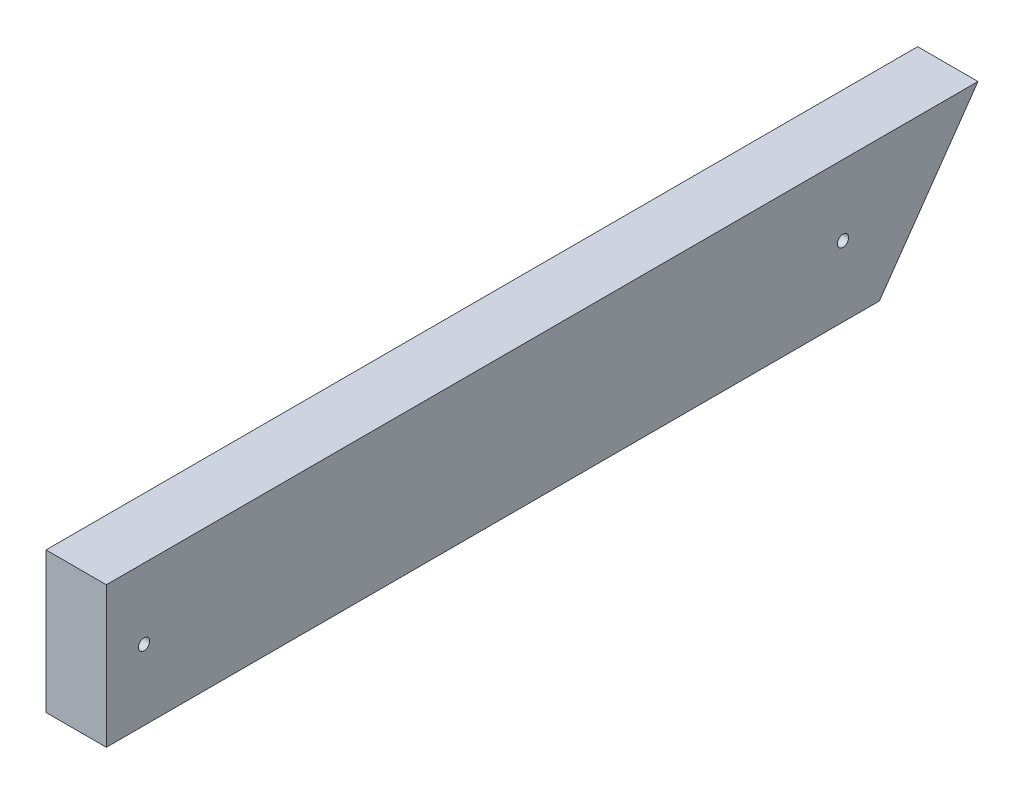
ISO-10303-21;
HEADER;
FILE_DESCRIPTION(('STEP AP214'),'2;1');
FILE_NAME('part.step','',(''),(''),'','','');
FILE_SCHEMA(('AUTOMOTIVE_DESIGN { 1 0 10303 214 1 1 1 1 }'));
ENDSEC;
DATA;
#1=APPLICATION_CONTEXT('core data for automotive mechanical design processes');
#2=APPLICATION_PROTOCOL_DEFINITION('international standard','automotive_design',2000,#1);
#3=PRODUCT_CONTEXT('',#1,'mechanical');
#4=PRODUCT('Part','Part','',(#3));
#5=PRODUCT_RELATED_PRODUCT_CATEGORY('part','',(#4));
#6=PRODUCT_DEFINITION_FORMATION('','',#4);
#7=PRODUCT_DEFINITION_CONTEXT('part definition',#1,'design');
#8=PRODUCT_DEFINITION('design','',#6,#7);
#9=PRODUCT_DEFINITION_SHAPE('','',#8);
#10=(LENGTH_UNIT() NAMED_UNIT(*) SI_UNIT(.MILLI.,.METRE.));
#11=(NAMED_UNIT(*) PLANE_ANGLE_UNIT() SI_UNIT($,.RADIAN.));
#12=(NAMED_UNIT(*) SI_UNIT($,.STERADIAN.) SOLID_ANGLE_UNIT());
#13=UNCERTAINTY_MEASURE_WITH_UNIT(LENGTH_MEASURE(1.E-05),#10,'distance_accuracy_value','');
#14=(GEOMETRIC_REPRESENTATION_CONTEXT(3) GLOBAL_UNCERTAINTY_ASSIGNED_CONTEXT((#13)) GLOBAL_UNIT_ASSIGNED_CONTEXT((#10,
#11,#12)) REPRESENTATION_CONTEXT('',''));
#15=CARTESIAN_POINT('',(0.,0.,0.));
#16=DIRECTION('',(0.,0.,1.));
#17=DIRECTION('',(1.,0.,0.));
#18=AXIS2_PLACEMENT_3D('',#15,#16,#17);
#19=CARTESIAN_POINT('',(38.1,88.9000000000007,0.));
#20=DIRECTION('',(0.,0.,-1.));
#21=DIRECTION('',(0.,1.,0.));
#22=AXIS2_PLACEMENT_3D('',#19,#20,#21);
#23=PLANE('',#22);
#24=DIRECTION('',(0.,-1.,0.));
#25=VECTOR('',#24,1.);
#26=CARTESIAN_POINT('',(0.,88.9000000000007,0.));
#27=LINE('',#26,#25);
#28=CARTESIAN_POINT('',(0.,88.9000000000007,0.));
#29=VERTEX_POINT('',#28);
#30=CARTESIAN_POINT('',(0.,0.,0.));
#31=VERTEX_POINT('',#30);
#32=EDGE_CURVE('E96',#29,#31,#27,.T.);
#33=ORIENTED_EDGE('',*,*,#32,.T.);
#34=DIRECTION('',(-1.,0.,0.));
#35=VECTOR('',#34,1.);
#36=CARTESIAN_POINT('',(38.1,0.,0.));
#37=LINE('',#36,#35);
#38=CARTESIAN_POINT('',(38.1,0.,0.));
#39=VERTEX_POINT('',#38);
#40=EDGE_CURVE('E11',#39,#31,#37,.T.);
#41=ORIENTED_EDGE('',*,*,#40,.F.);
#42=DIRECTION('',(0.,-1.,0.));
#43=VECTOR('',#42,1.);
#44=CARTESIAN_POINT('',(38.1,88.9000000000007,0.));
#45=LINE('',#44,#43);
#46=CARTESIAN_POINT('',(38.1,88.9000000000007,0.));
#47=VERTEX_POINT('',#46);
#48=EDGE_CURVE('E84',#47,#39,#45,.T.);
#49=ORIENTED_EDGE('',*,*,#48,.F.);
#50=DIRECTION('',(-1.,0.,0.));
#51=VECTOR('',#50,1.);
#52=CARTESIAN_POINT('',(38.1,88.9000000000007,0.));
#53=LINE('',#52,#51);
#54=EDGE_CURVE('E92',#47,#29,#53,.T.);
#55=ORIENTED_EDGE('',*,*,#54,.T.);
#56=EDGE_LOOP('',(#33,#41,#49,#55));
#57=FACE_BOUND('',#56,.T.);
#58=ADVANCED_FACE('F33',(#57),#23,.F.);
#59=CARTESIAN_POINT('',(38.1,0.,-488.13777319626));
#60=DIRECTION('',(0.,1.,0.));
#61=DIRECTION('',(0.,0.,1.));
#62=AXIS2_PLACEMENT_3D('',#59,#60,#61);
#63=PLANE('',#62);
#64=DIRECTION('',(0.,0.,-1.));
#65=VECTOR('',#64,1.);
#66=CARTESIAN_POINT('',(0.,0.,-488.13777319626));
#67=LINE('',#66,#65);
#68=CARTESIAN_POINT('',(0.,0.,-488.13777319626));
#69=VERTEX_POINT('',#68);
#70=EDGE_CURVE('E88',#31,#69,#67,.T.);
#71=ORIENTED_EDGE('',*,*,#70,.T.);
#72=DIRECTION('',(-1.,0.,0.));
#73=VECTOR('',#72,1.);
#74=CARTESIAN_POINT('',(38.1,0.,-488.13777319626));
#75=LINE('',#74,#73);
#76=CARTESIAN_POINT('',(38.1,0.,-488.13777319626));
#77=VERTEX_POINT('',#76);
#78=EDGE_CURVE('E41',#77,#69,#75,.T.);
#79=ORIENTED_EDGE('',*,*,#78,.F.);
#80=DIRECTION('',(0.,0.,-1.));
#81=VECTOR('',#80,1.);
#82=CARTESIAN_POINT('',(38.1,0.,-488.13777319626));
#83=LINE('',#82,#81);
#84=EDGE_CURVE('E79',#39,#77,#83,.T.);
#85=ORIENTED_EDGE('',*,*,#84,.F.);
#86=ORIENTED_EDGE('',*,*,#40,.T.);
#87=EDGE_LOOP('',(#71,#79,#85,#86));
#88=FACE_BOUND('',#87,.T.);
#89=ADVANCED_FACE('F87',(#88),#63,.F.);
#90=CARTESIAN_POINT('',(38.1,88.9000000000001,-550.386223343104));
#91=DIRECTION('',(0.,0.57357643635105,0.819152044288989));
#92=DIRECTION('',(0.,-0.819152044288989,0.57357643635105));
#93=AXIS2_PLACEMENT_3D('',#90,#91,#92);
#94=PLANE('',#93);
#95=DIRECTION('',(0.,0.819152044288989,-0.57357643635105));
#96=VECTOR('',#95,1.);
#97=CARTESIAN_POINT('',(0.,88.9000000000001,-550.386223343104));
#98=LINE('',#97,#96);
#99=CARTESIAN_POINT('',(0.,88.9000000000001,-550.386223343104));
#100=VERTEX_POINT('',#99);
#101=EDGE_CURVE('E66',#69,#100,#98,.T.);
#102=ORIENTED_EDGE('',*,*,#101,.T.);
#103=DIRECTION('',(-1.,0.,0.));
#104=VECTOR('',#103,1.);
#105=CARTESIAN_POINT('',(38.1,88.9000000000001,-550.386223343104));
#106=LINE('',#105,#104);
#107=CARTESIAN_POINT('',(38.1,88.9000000000001,-550.386223343104));
#108=VERTEX_POINT('',#107);
#109=EDGE_CURVE('E89',#108,#100,#106,.T.);
#110=ORIENTED_EDGE('',*,*,#109,.F.);
#111=DIRECTION('',(0.,0.819152044288989,-0.57357643635105));
#112=VECTOR('',#111,1.);
#113=CARTESIAN_POINT('',(38.1,88.9000000000001,-550.386223343104));
#114=LINE('',#113,#112);
#115=EDGE_CURVE('E82',#77,#108,#114,.T.);
#116=ORIENTED_EDGE('',*,*,#115,.F.);
#117=ORIENTED_EDGE('',*,*,#78,.T.);
#118=EDGE_LOOP('',(#102,#110,#116,#117));
#119=FACE_BOUND('',#118,.T.);
#120=ADVANCED_FACE('F90',(#119),#94,.F.);
#121=CARTESIAN_POINT('',(38.1,88.9000000000007,0.));
#122=DIRECTION('',(0.,-1.,0.));
#123=DIRECTION('',(0.,0.,-1.));
#124=AXIS2_PLACEMENT_3D('',#121,#122,#123);
#125=PLANE('',#124);
#126=DIRECTION('',(0.,0.,1.));
#127=VECTOR('',#126,1.);
#128=CARTESIAN_POINT('',(0.,88.9000000000007,0.));
#129=LINE('',#128,#127);
#130=EDGE_CURVE('E72',#100,#29,#129,.T.);
#131=ORIENTED_EDGE('',*,*,#130,.T.);
#132=ORIENTED_EDGE('',*,*,#54,.F.);
#133=DIRECTION('',(0.,0.,1.));
#134=VECTOR('',#133,1.);
#135=CARTESIAN_POINT('',(38.1,88.9000000000007,0.));
#136=LINE('',#135,#134);
#137=EDGE_CURVE('E49',#108,#47,#136,.T.);
#138=ORIENTED_EDGE('',*,*,#137,.F.);
#139=ORIENTED_EDGE('',*,*,#109,.T.);
#140=EDGE_LOOP('',(#131,#132,#138,#139));
#141=FACE_BOUND('',#140,.T.);
#142=ADVANCED_FACE('F104',(#141),#125,.F.);
#143=CARTESIAN_POINT('',(38.1,0.,0.));
#144=DIRECTION('',(-1.,0.,0.));
#145=DIRECTION('',(0.,0.,1.));
#146=AXIS2_PLACEMENT_3D('',#143,#144,#145);
#147=PLANE('',#146);
#148=CARTESIAN_POINT('',(38.1,44.45,-23.8125));
#149=DIRECTION('',(1.,0.,0.));
#150=DIRECTION('',(0.,0.,-1.));
#151=AXIS2_PLACEMENT_3D('',#148,#149,#150);
#152=CIRCLE('',#151,3.57187500000001);
#153=CARTESIAN_POINT('',(38.1,44.45,-27.384375));
#154=VERTEX_POINT('',#153);
#155=EDGE_CURVE('E116',#154,#154,#152,.T.);
#156=ORIENTED_EDGE('',*,*,#155,.F.);
#157=EDGE_LOOP('',(#156));
#158=FACE_BOUND('',#157,.T.);
#159=CARTESIAN_POINT('',(38.1,44.4500000000001,-465.1375));
#160=DIRECTION('',(1.,0.,0.));
#161=DIRECTION('',(0.,0.,-1.));
#162=AXIS2_PLACEMENT_3D('',#159,#160,#161);
#163=CIRCLE('',#162,3.57187499999998);
#164=CARTESIAN_POINT('',(38.1,44.4500000000001,-468.709375));
#165=VERTEX_POINT('',#164);
#166=EDGE_CURVE('E110',#165,#165,#163,.T.);
#167=ORIENTED_EDGE('',*,*,#166,.F.);
#168=EDGE_LOOP('',(#167));
#169=FACE_BOUND('',#168,.T.);
#170=ORIENTED_EDGE('',*,*,#48,.T.);
#171=ORIENTED_EDGE('',*,*,#84,.T.);
#172=ORIENTED_EDGE('',*,*,#115,.T.);
#173=ORIENTED_EDGE('',*,*,#137,.T.);
#174=EDGE_LOOP('',(#170,#171,#172,#173));
#175=FACE_BOUND('',#174,.T.);
#176=ADVANCED_FACE('F80',(#158,#169,#175),#147,.F.);
#177=CARTESIAN_POINT('',(0.,0.,0.));
#178=DIRECTION('',(-1.,0.,0.));
#179=DIRECTION('',(0.,0.,1.));
#180=AXIS2_PLACEMENT_3D('',#177,#178,#179);
#181=PLANE('',#180);
#182=CARTESIAN_POINT('',(0.,44.45,-23.8125));
#183=DIRECTION('',(1.,0.,0.));
#184=DIRECTION('',(0.,0.,-1.));
#185=AXIS2_PLACEMENT_3D('',#182,#183,#184);
#186=CIRCLE('',#185,3.57187500000001);
#187=CARTESIAN_POINT('',(0.,44.45,-27.384375));
#188=VERTEX_POINT('',#187);
#189=EDGE_CURVE('E99',#188,#188,#186,.T.);
#190=ORIENTED_EDGE('',*,*,#189,.T.);
#191=EDGE_LOOP('',(#190));
#192=FACE_BOUND('',#191,.T.);
#193=CARTESIAN_POINT('',(0.,44.4500000000001,-465.1375));
#194=DIRECTION('',(1.,0.,0.));
#195=DIRECTION('',(0.,0.,-1.));
#196=AXIS2_PLACEMENT_3D('',#193,#194,#195);
#197=CIRCLE('',#196,3.57187499999998);
#198=CARTESIAN_POINT('',(0.,44.4500000000001,-468.709375));
#199=VERTEX_POINT('',#198);
#200=EDGE_CURVE('E113',#199,#199,#197,.T.);
#201=ORIENTED_EDGE('',*,*,#200,.T.);
#202=EDGE_LOOP('',(#201));
#203=FACE_BOUND('',#202,.T.);
#204=ORIENTED_EDGE('',*,*,#32,.F.);
#205=ORIENTED_EDGE('',*,*,#130,.F.);
#206=ORIENTED_EDGE('',*,*,#101,.F.);
#207=ORIENTED_EDGE('',*,*,#70,.F.);
#208=EDGE_LOOP('',(#204,#205,#206,#207));
#209=FACE_BOUND('',#208,.T.);
#210=ADVANCED_FACE('F107',(#192,#203,#209),#181,.T.);
#211=CARTESIAN_POINT('',(0.,44.4500000000001,-465.1375));
#212=DIRECTION('',(1.,0.,0.));
#213=DIRECTION('',(0.,0.,-1.));
#214=AXIS2_PLACEMENT_3D('',#211,#212,#213);
#215=CYLINDRICAL_SURFACE('',#214,3.57187499999998);
#216=CARTESIAN_POINT('',(0.,44.4500000000001,-468.709375));
#217=CARTESIAN_POINT('',(0.396875,44.4500000000001,-468.709375));
#218=CARTESIAN_POINT('',(0.79375,44.4500000000001,-468.709375));
#219=CARTESIAN_POINT('',(1.5875,44.4500000000001,-468.709375));
#220=CARTESIAN_POINT('',(1.984375,44.4500000000001,-468.709375));
#221=CARTESIAN_POINT('',(2.778125,44.4500000000001,-468.709375));
#222=CARTESIAN_POINT('',(3.175,44.4500000000001,-468.709375));
#223=CARTESIAN_POINT('',(3.96875,44.4500000000001,-468.709375));
#224=CARTESIAN_POINT('',(4.365625,44.4500000000001,-468.709375));
#225=CARTESIAN_POINT('',(5.159375,44.4500000000001,-468.709375));
#226=CARTESIAN_POINT('',(5.55625,44.4500000000001,-468.709375));
#227=CARTESIAN_POINT('',(6.35,44.4500000000001,-468.709375));
#228=CARTESIAN_POINT('',(6.746875,44.4500000000001,-468.709375));
#229=CARTESIAN_POINT('',(7.540625,44.4500000000001,-468.709375));
#230=CARTESIAN_POINT('',(7.9375,44.4500000000001,-468.709375));
#231=CARTESIAN_POINT('',(8.73125,44.4500000000001,-468.709375));
#232=CARTESIAN_POINT('',(9.128125,44.4500000000001,-468.709375));
#233=CARTESIAN_POINT('',(9.921875,44.4500000000001,-468.709375));
#234=CARTESIAN_POINT('',(10.31875,44.4500000000001,-468.709375));
#235=CARTESIAN_POINT('',(11.1125,44.4500000000001,-468.709375));
#236=CARTESIAN_POINT('',(11.509375,44.4500000000001,-468.709375));
#237=CARTESIAN_POINT('',(12.303125,44.4500000000001,-468.709375));
#238=CARTESIAN_POINT('',(12.7,44.4500000000001,-468.709375));
#239=CARTESIAN_POINT('',(13.49375,44.4500000000001,-468.709375));
#240=CARTESIAN_POINT('',(13.890625,44.4500000000001,-468.709375));
#241=CARTESIAN_POINT('',(14.684375,44.4500000000001,-468.709375));
#242=CARTESIAN_POINT('',(15.08125,44.4500000000001,-468.709375));
#243=CARTESIAN_POINT('',(15.875,44.4500000000001,-468.709375));
#244=CARTESIAN_POINT('',(16.271875,44.4500000000001,-468.709375));
#245=CARTESIAN_POINT('',(17.065625,44.4500000000001,-468.709375));
#246=CARTESIAN_POINT('',(17.4625,44.4500000000001,-468.709375));
#247=CARTESIAN_POINT('',(18.25625,44.4500000000001,-468.709375));
#248=CARTESIAN_POINT('',(18.653125,44.4500000000001,-468.709375));
#249=CARTESIAN_POINT('',(19.446875,44.4500000000001,-468.709375));
#250=CARTESIAN_POINT('',(19.84375,44.4500000000001,-468.709375));
#251=CARTESIAN_POINT('',(20.6375,44.4500000000001,-468.709375));
#252=CARTESIAN_POINT('',(21.034375,44.4500000000001,-468.709375));
#253=CARTESIAN_POINT('',(21.828125,44.4500000000001,-468.709375));
#254=CARTESIAN_POINT('',(22.225,44.4500000000001,-468.709375));
#255=CARTESIAN_POINT('',(23.01875,44.4500000000001,-468.709375));
#256=CARTESIAN_POINT('',(23.415625,44.4500000000001,-468.709375));
#257=CARTESIAN_POINT('',(24.209375,44.4500000000001,-468.709375));
#258=CARTESIAN_POINT('',(24.60625,44.4500000000001,-468.709375));
#259=CARTESIAN_POINT('',(25.4,44.4500000000001,-468.709375));
#260=CARTESIAN_POINT('',(25.796875,44.4500000000001,-468.709375));
#261=CARTESIAN_POINT('',(26.590625,44.4500000000001,-468.709375));
#262=CARTESIAN_POINT('',(26.9875,44.4500000000001,-468.709375));
#263=CARTESIAN_POINT('',(27.78125,44.4500000000001,-468.709375));
#264=CARTESIAN_POINT('',(28.178125,44.4500000000001,-468.709375));
#265=CARTESIAN_POINT('',(28.971875,44.4500000000001,-468.709375));
#266=CARTESIAN_POINT('',(29.36875,44.4500000000001,-468.709375));
#267=CARTESIAN_POINT('',(30.1625,44.4500000000001,-468.709375));
#268=CARTESIAN_POINT('',(30.559375,44.4500000000001,-468.709375));
#269=CARTESIAN_POINT('',(31.353125,44.4500000000001,-468.709375));
#270=CARTESIAN_POINT('',(31.75,44.4500000000001,-468.709375));
#271=CARTESIAN_POINT('',(32.54375,44.4500000000001,-468.709375));
#272=CARTESIAN_POINT('',(32.940625,44.4500000000001,-468.709375));
#273=CARTESIAN_POINT('',(33.734375,44.4500000000001,-468.709375));
#274=CARTESIAN_POINT('',(34.13125,44.4500000000001,-468.709375));
#275=CARTESIAN_POINT('',(34.925,44.4500000000001,-468.709375));
#276=CARTESIAN_POINT('',(35.321875,44.4500000000001,-468.709375));
#277=CARTESIAN_POINT('',(36.115625,44.4500000000001,-468.709375));
#278=CARTESIAN_POINT('',(36.5125,44.4500000000001,-468.709375));
#279=CARTESIAN_POINT('',(37.30625,44.4500000000001,-468.709375));
#280=CARTESIAN_POINT('',(37.703125,44.4500000000001,-468.709375));
#281=CARTESIAN_POINT('',(38.1,44.4500000000001,-468.709375));
#282=B_SPLINE_CURVE_WITH_KNOTS('',3,(#216,#217,#218,#219,#220,#221,#222,#223,#224,#225,#226,
#227,#228,#229,#230,#231,#232,#233,#234,#235,#236,#237,#238,#239,#240,#241,#242,#243,#244,#245,
#246,#247,#248,#249,#250,#251,#252,#253,#254,#255,#256,#257,#258,#259,#260,#261,#262,#263,#264,
#265,#266,#267,#268,#269,#270,#271,#272,#273,#274,#275,#276,#277,#278,#279,#280,#281),
.UNSPECIFIED.,.F.,.F.,(4,2,2,2,2,2,2,2,2,2,2,2,2,2,2,2,2,2,2,2,2,2,2,2,2,2,2,2,2,2,2,2,4),(0.,
1.190625,2.38125,3.571875,4.7625,5.953125,7.14375,8.334375,9.525,10.715625,11.90625,13.096875,
14.2875,15.478125,16.66875,17.859375,19.05,20.240625,21.43125,22.621875,23.8125,25.003125,
26.19375,27.384375,28.575,29.765625,30.95625,32.146875,33.3375,34.528125,35.71875,36.909375,
38.1),.UNSPECIFIED.);
#283=EDGE_CURVE('BSEAM127',#199,#165,#282,.T.);
#284=ORIENTED_EDGE('',*,*,#200,.F.);
#285=ORIENTED_EDGE('',*,*,#166,.T.);
#286=ORIENTED_EDGE('',*,*,#283,.T.);
#287=ORIENTED_EDGE('',*,*,#283,.F.);
#288=EDGE_LOOP('',(#284,#286,#285,#287));
#289=FACE_BOUND('',#288,.T.);
#290=ADVANCED_FACE('F127',(#289),#215,.F.);
#291=CARTESIAN_POINT('',(0.,44.45,-23.8125));
#292=DIRECTION('',(1.,0.,0.));
#293=DIRECTION('',(0.,0.,-1.));
#294=AXIS2_PLACEMENT_3D('',#291,#292,#293);
#295=CYLINDRICAL_SURFACE('',#294,3.57187500000001);
#296=CARTESIAN_POINT('',(0.,44.45,-27.384375));
#297=CARTESIAN_POINT('',(0.396875,44.45,-27.384375));
#298=CARTESIAN_POINT('',(0.79375,44.45,-27.384375));
#299=CARTESIAN_POINT('',(1.5875,44.45,-27.384375));
#300=CARTESIAN_POINT('',(1.984375,44.45,-27.384375));
#301=CARTESIAN_POINT('',(2.778125,44.45,-27.384375));
#302=CARTESIAN_POINT('',(3.175,44.45,-27.384375));
#303=CARTESIAN_POINT('',(3.96875,44.45,-27.384375));
#304=CARTESIAN_POINT('',(4.365625,44.45,-27.384375));
#305=CARTESIAN_POINT('',(5.159375,44.45,-27.384375));
#306=CARTESIAN_POINT('',(5.55625,44.45,-27.384375));
#307=CARTESIAN_POINT('',(6.35,44.45,-27.384375));
#308=CARTESIAN_POINT('',(6.746875,44.45,-27.384375));
#309=CARTESIAN_POINT('',(7.540625,44.45,-27.384375));
#310=CARTESIAN_POINT('',(7.9375,44.45,-27.384375));
#311=CARTESIAN_POINT('',(8.73125,44.45,-27.384375));
#312=CARTESIAN_POINT('',(9.128125,44.45,-27.384375));
#313=CARTESIAN_POINT('',(9.921875,44.45,-27.384375));
#314=CARTESIAN_POINT('',(10.31875,44.45,-27.384375));
#315=CARTESIAN_POINT('',(11.1125,44.45,-27.384375));
#316=CARTESIAN_POINT('',(11.509375,44.45,-27.384375));
#317=CARTESIAN_POINT('',(12.303125,44.45,-27.384375));
#318=CARTESIAN_POINT('',(12.7,44.45,-27.384375));
#319=CARTESIAN_POINT('',(13.49375,44.45,-27.384375));
#320=CARTESIAN_POINT('',(13.890625,44.45,-27.384375));
#321=CARTESIAN_POINT('',(14.684375,44.45,-27.384375));
#322=CARTESIAN_POINT('',(15.08125,44.45,-27.384375));
#323=CARTESIAN_POINT('',(15.875,44.45,-27.384375));
#324=CARTESIAN_POINT('',(16.271875,44.45,-27.384375));
#325=CARTESIAN_POINT('',(17.065625,44.45,-27.384375));
#326=CARTESIAN_POINT('',(17.4625,44.45,-27.384375));
#327=CARTESIAN_POINT('',(18.25625,44.45,-27.384375));
#328=CARTESIAN_POINT('',(18.653125,44.45,-27.384375));
#329=CARTESIAN_POINT('',(19.446875,44.45,-27.384375));
#330=CARTESIAN_POINT('',(19.84375,44.45,-27.384375));
#331=CARTESIAN_POINT('',(20.6375,44.45,-27.384375));
#332=CARTESIAN_POINT('',(21.034375,44.45,-27.384375));
#333=CARTESIAN_POINT('',(21.828125,44.45,-27.384375));
#334=CARTESIAN_POINT('',(22.225,44.45,-27.384375));
#335=CARTESIAN_POINT('',(23.01875,44.45,-27.384375));
#336=CARTESIAN_POINT('',(23.415625,44.45,-27.384375));
#337=CARTESIAN_POINT('',(24.209375,44.45,-27.384375));
#338=CARTESIAN_POINT('',(24.60625,44.45,-27.384375));
#339=CARTESIAN_POINT('',(25.4,44.45,-27.384375));
#340=CARTESIAN_POINT('',(25.796875,44.45,-27.384375));
#341=CARTESIAN_POINT('',(26.590625,44.45,-27.384375));
#342=CARTESIAN_POINT('',(26.9875,44.45,-27.384375));
#343=CARTESIAN_POINT('',(27.78125,44.45,-27.384375));
#344=CARTESIAN_POINT('',(28.178125,44.45,-27.384375));
#345=CARTESIAN_POINT('',(28.971875,44.45,-27.384375));
#346=CARTESIAN_POINT('',(29.36875,44.45,-27.384375));
#347=CARTESIAN_POINT('',(30.1625,44.45,-27.384375));
#348=CARTESIAN_POINT('',(30.559375,44.45,-27.384375));
#349=CARTESIAN_POINT('',(31.353125,44.45,-27.384375));
#350=CARTESIAN_POINT('',(31.75,44.45,-27.384375));
#351=CARTESIAN_POINT('',(32.54375,44.45,-27.384375));
#352=CARTESIAN_POINT('',(32.940625,44.45,-27.384375));
#353=CARTESIAN_POINT('',(33.734375,44.45,-27.384375));
#354=CARTESIAN_POINT('',(34.13125,44.45,-27.384375));
#355=CARTESIAN_POINT('',(34.925,44.45,-27.384375));
#356=CARTESIAN_POINT('',(35.321875,44.45,-27.384375));
#357=CARTESIAN_POINT('',(36.115625,44.45,-27.384375));
#358=CARTESIAN_POINT('',(36.5125,44.45,-27.384375));
#359=CARTESIAN_POINT('',(37.30625,44.45,-27.384375));
#360=CARTESIAN_POINT('',(37.703125,44.45,-27.384375));
#361=CARTESIAN_POINT('',(38.1,44.45,-27.384375));
#362=B_SPLINE_CURVE_WITH_KNOTS('',3,(#296,#297,#298,#299,#300,#301,#302,#303,#304,#305,#306,
#307,#308,#309,#310,#311,#312,#313,#314,#315,#316,#317,#318,#319,#320,#321,#322,#323,#324,#325,
#326,#327,#328,#329,#330,#331,#332,#333,#334,#335,#336,#337,#338,#339,#340,#341,#342,#343,#344,
#345,#346,#347,#348,#349,#350,#351,#352,#353,#354,#355,#356,#357,#358,#359,#360,#361),
.UNSPECIFIED.,.F.,.F.,(4,2,2,2,2,2,2,2,2,2,2,2,2,2,2,2,2,2,2,2,2,2,2,2,2,2,2,2,2,2,2,2,4),(0.,
1.190625,2.38125,3.571875,4.7625,5.953125,7.14375,8.334375,9.525,10.715625,11.90625,13.096875,
14.2875,15.478125,16.66875,17.859375,19.05,20.240625,21.43125,22.621875,23.8125,25.003125,
26.19375,27.384375,28.575,29.765625,30.95625,32.146875,33.3375,34.528125,35.71875,36.909375,
38.1),.UNSPECIFIED.);
#363=EDGE_CURVE('BSEAM124',#188,#154,#362,.T.);
#364=ORIENTED_EDGE('',*,*,#189,.F.);
#365=ORIENTED_EDGE('',*,*,#155,.T.);
#366=ORIENTED_EDGE('',*,*,#363,.T.);
#367=ORIENTED_EDGE('',*,*,#363,.F.);
#368=EDGE_LOOP('',(#364,#366,#365,#367));
#369=FACE_BOUND('',#368,.T.);
#370=ADVANCED_FACE('F124',(#369),#295,.F.);
#371=CLOSED_SHELL('',(#58,#89,#120,#142,#176,#210,#290,#370));
#372=MANIFOLD_SOLID_BREP('B2',#371);
#373=ADVANCED_BREP_SHAPE_REPRESENTATION('',(#18,#372),#14);
#374=SHAPE_DEFINITION_REPRESENTATION(#9,#373);
ENDSEC;
END-ISO-10303-21;
